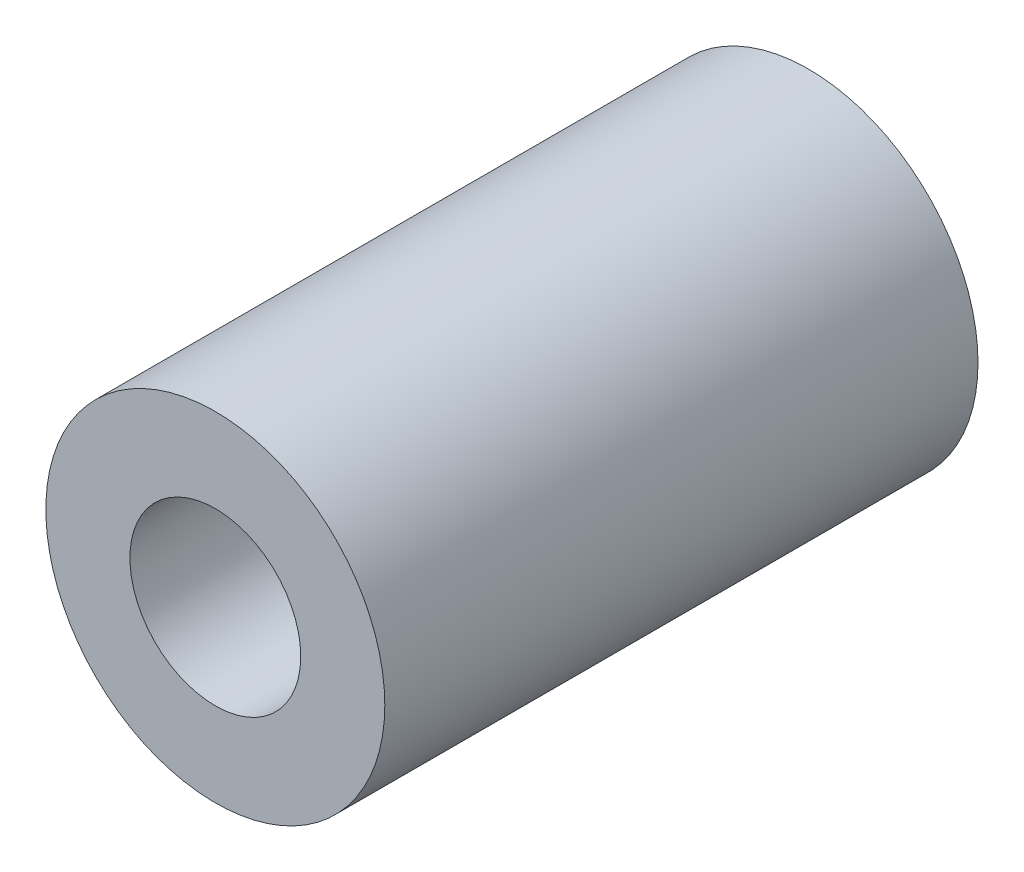
ISO-10303-21;
HEADER;
FILE_DESCRIPTION(('STEP AP214'),'2;1');
FILE_NAME('part.step','',(''),(''),'','','');
FILE_SCHEMA(('AUTOMOTIVE_DESIGN { 1 0 10303 214 1 1 1 1 }'));
ENDSEC;
DATA;
#1=APPLICATION_CONTEXT('core data for automotive mechanical design processes');
#2=APPLICATION_PROTOCOL_DEFINITION('international standard','automotive_design',2000,#1);
#3=PRODUCT_CONTEXT('',#1,'mechanical');
#4=PRODUCT('Part','Part','',(#3));
#5=PRODUCT_RELATED_PRODUCT_CATEGORY('part','',(#4));
#6=PRODUCT_DEFINITION_FORMATION('','',#4);
#7=PRODUCT_DEFINITION_CONTEXT('part definition',#1,'design');
#8=PRODUCT_DEFINITION('design','',#6,#7);
#9=PRODUCT_DEFINITION_SHAPE('','',#8);
#10=(LENGTH_UNIT() NAMED_UNIT(*) SI_UNIT(.MILLI.,.METRE.));
#11=(NAMED_UNIT(*) PLANE_ANGLE_UNIT() SI_UNIT($,.RADIAN.));
#12=(NAMED_UNIT(*) SI_UNIT($,.STERADIAN.) SOLID_ANGLE_UNIT());
#13=UNCERTAINTY_MEASURE_WITH_UNIT(LENGTH_MEASURE(1.E-05),#10,'distance_accuracy_value','');
#14=(GEOMETRIC_REPRESENTATION_CONTEXT(3) GLOBAL_UNCERTAINTY_ASSIGNED_CONTEXT((#13)) GLOBAL_UNIT_ASSIGNED_CONTEXT((#10,
#11,#12)) REPRESENTATION_CONTEXT('',''));
#15=CARTESIAN_POINT('',(0.,0.,0.));
#16=DIRECTION('',(0.,0.,1.));
#17=DIRECTION('',(1.,0.,0.));
#18=AXIS2_PLACEMENT_3D('',#15,#16,#17);
#19=CARTESIAN_POINT('',(0.,0.,11.1125));
#20=DIRECTION('',(0.,0.,1.));
#21=DIRECTION('',(1.,0.,0.));
#22=AXIS2_PLACEMENT_3D('',#19,#20,#21);
#23=PLANE('',#22);
#24=CARTESIAN_POINT('',(0.,0.,11.1125));
#25=DIRECTION('',(0.,0.,1.));
#26=DIRECTION('',(1.,0.,0.));
#27=AXIS2_PLACEMENT_3D('',#24,#25,#26);
#28=CIRCLE('',#27,6.35);
#29=CARTESIAN_POINT('',(6.35,0.,11.1125));
#30=VERTEX_POINT('',#29);
#31=EDGE_CURVE('E10',#30,#30,#28,.T.);
#32=ORIENTED_EDGE('',*,*,#31,.T.);
#33=EDGE_LOOP('',(#32));
#34=FACE_BOUND('',#33,.T.);
#35=CARTESIAN_POINT('',(0.,0.,11.1125));
#36=DIRECTION('',(0.,0.,1.));
#37=DIRECTION('',(1.,0.,0.));
#38=AXIS2_PLACEMENT_3D('',#35,#36,#37);
#39=CIRCLE('',#38,3.2004);
#40=CARTESIAN_POINT('',(3.2004,0.,11.1125));
#41=VERTEX_POINT('',#40);
#42=EDGE_CURVE('E42',#41,#41,#39,.T.);
#43=ORIENTED_EDGE('',*,*,#42,.F.);
#44=EDGE_LOOP('',(#43));
#45=FACE_BOUND('',#44,.T.);
#46=ADVANCED_FACE('F31',(#34,#45),#23,.T.);
#47=CARTESIAN_POINT('',(0.,0.,-11.1125));
#48=DIRECTION('',(0.,0.,1.));
#49=DIRECTION('',(1.,0.,0.));
#50=AXIS2_PLACEMENT_3D('',#47,#48,#49);
#51=PLANE('',#50);
#52=CARTESIAN_POINT('',(0.,0.,-11.1125));
#53=DIRECTION('',(0.,0.,1.));
#54=DIRECTION('',(1.,0.,0.));
#55=AXIS2_PLACEMENT_3D('',#52,#53,#54);
#56=CIRCLE('',#55,6.35);
#57=CARTESIAN_POINT('',(6.35,0.,-11.1125));
#58=VERTEX_POINT('',#57);
#59=EDGE_CURVE('E35',#58,#58,#56,.T.);
#60=ORIENTED_EDGE('',*,*,#59,.F.);
#61=EDGE_LOOP('',(#60));
#62=FACE_BOUND('',#61,.T.);
#63=CARTESIAN_POINT('',(0.,0.,-11.1125));
#64=DIRECTION('',(0.,0.,1.));
#65=DIRECTION('',(1.,0.,0.));
#66=AXIS2_PLACEMENT_3D('',#63,#64,#65);
#67=CIRCLE('',#66,3.2004);
#68=CARTESIAN_POINT('',(3.2004,0.,-11.1125));
#69=VERTEX_POINT('',#68);
#70=EDGE_CURVE('E44',#69,#69,#67,.T.);
#71=ORIENTED_EDGE('',*,*,#70,.T.);
#72=EDGE_LOOP('',(#71));
#73=FACE_BOUND('',#72,.T.);
#74=ADVANCED_FACE('F54',(#62,#73),#51,.F.);
#75=CARTESIAN_POINT('',(0.,0.,11.1125));
#76=DIRECTION('',(0.,0.,-1.));
#77=DIRECTION('',(-1.,0.,0.));
#78=AXIS2_PLACEMENT_3D('',#75,#76,#77);
#79=CYLINDRICAL_SURFACE('',#78,6.35);
#80=ORIENTED_EDGE('',*,*,#31,.F.);
#81=EDGE_LOOP('',(#80));
#82=FACE_BOUND('',#81,.T.);
#83=ORIENTED_EDGE('',*,*,#59,.T.);
#84=EDGE_LOOP('',(#83));
#85=FACE_BOUND('',#84,.T.);
#86=ADVANCED_FACE('F33',(#82,#85),#79,.T.);
#87=CARTESIAN_POINT('',(0.,0.,11.1125));
#88=DIRECTION('',(0.,0.,-1.));
#89=DIRECTION('',(-1.,0.,0.));
#90=AXIS2_PLACEMENT_3D('',#87,#88,#89);
#91=CYLINDRICAL_SURFACE('',#90,3.2004);
#92=ORIENTED_EDGE('',*,*,#42,.T.);
#93=EDGE_LOOP('',(#92));
#94=FACE_BOUND('',#93,.T.);
#95=ORIENTED_EDGE('',*,*,#70,.F.);
#96=EDGE_LOOP('',(#95));
#97=FACE_BOUND('',#96,.T.);
#98=ADVANCED_FACE('F50',(#94,#97),#91,.F.);
#99=CLOSED_SHELL('',(#46,#74,#86,#98));
#100=MANIFOLD_SOLID_BREP('B2',#99);
#101=ADVANCED_BREP_SHAPE_REPRESENTATION('',(#18,#100),#14);
#102=SHAPE_DEFINITION_REPRESENTATION(#9,#101);
ENDSEC;
END-ISO-10303-21;
